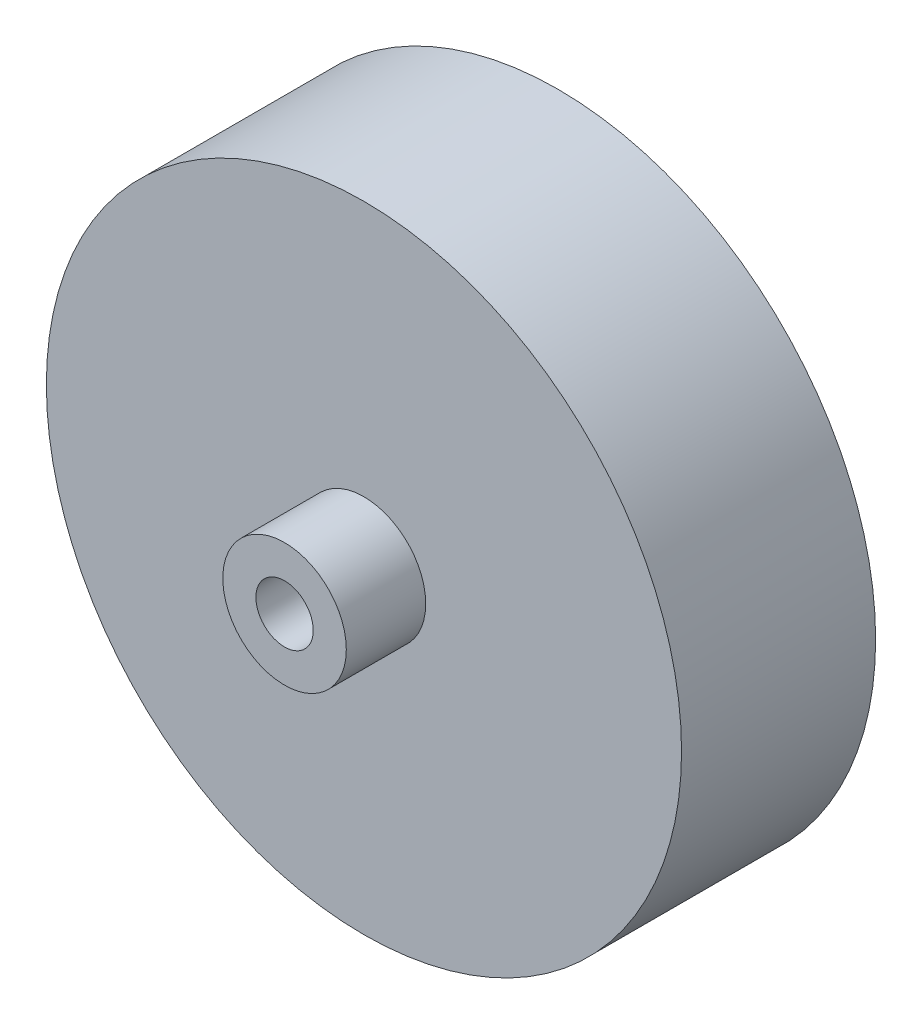
ISO-10303-21;
HEADER;
FILE_DESCRIPTION(('STEP AP214'),'2;1');
FILE_NAME('part.step','',(''),(''),'','','');
FILE_SCHEMA(('AUTOMOTIVE_DESIGN { 1 0 10303 214 1 1 1 1 }'));
ENDSEC;
DATA;
#1=APPLICATION_CONTEXT('core data for automotive mechanical design processes');
#2=APPLICATION_PROTOCOL_DEFINITION('international standard','automotive_design',2000,#1);
#3=PRODUCT_CONTEXT('',#1,'mechanical');
#4=PRODUCT('Part','Part','',(#3));
#5=PRODUCT_RELATED_PRODUCT_CATEGORY('part','',(#4));
#6=PRODUCT_DEFINITION_FORMATION('','',#4);
#7=PRODUCT_DEFINITION_CONTEXT('part definition',#1,'design');
#8=PRODUCT_DEFINITION('design','',#6,#7);
#9=PRODUCT_DEFINITION_SHAPE('','',#8);
#10=(LENGTH_UNIT() NAMED_UNIT(*) SI_UNIT(.MILLI.,.METRE.));
#11=(NAMED_UNIT(*) PLANE_ANGLE_UNIT() SI_UNIT($,.RADIAN.));
#12=(NAMED_UNIT(*) SI_UNIT($,.STERADIAN.) SOLID_ANGLE_UNIT());
#13=UNCERTAINTY_MEASURE_WITH_UNIT(LENGTH_MEASURE(1.E-05),#10,'distance_accuracy_value','');
#14=(GEOMETRIC_REPRESENTATION_CONTEXT(3) GLOBAL_UNCERTAINTY_ASSIGNED_CONTEXT((#13)) GLOBAL_UNIT_ASSIGNED_CONTEXT((#10,
#11,#12)) REPRESENTATION_CONTEXT('',''));
#15=CARTESIAN_POINT('',(0.,0.,0.));
#16=DIRECTION('',(0.,0.,1.));
#17=DIRECTION('',(1.,0.,0.));
#18=AXIS2_PLACEMENT_3D('',#15,#16,#17);
#19=CARTESIAN_POINT('',(0.,0.,22.));
#20=DIRECTION('',(0.,0.,-1.));
#21=DIRECTION('',(-1.,0.,0.));
#22=AXIS2_PLACEMENT_3D('',#19,#20,#21);
#23=CYLINDRICAL_SURFACE('',#22,36.);
#24=CARTESIAN_POINT('',(0.,0.,22.));
#25=DIRECTION('',(0.,0.,1.));
#26=DIRECTION('',(1.,0.,0.));
#27=AXIS2_PLACEMENT_3D('',#24,#25,#26);
#28=CIRCLE('',#27,36.);
#29=CARTESIAN_POINT('',(36.,0.,22.));
#30=VERTEX_POINT('',#29);
#31=EDGE_CURVE('E51',#30,#30,#28,.T.);
#32=ORIENTED_EDGE('',*,*,#31,.F.);
#33=EDGE_LOOP('',(#32));
#34=FACE_BOUND('',#33,.T.);
#35=CARTESIAN_POINT('',(0.,0.,0.));
#36=DIRECTION('',(0.,0.,1.));
#37=DIRECTION('',(1.,0.,0.));
#38=AXIS2_PLACEMENT_3D('',#35,#36,#37);
#39=CIRCLE('',#38,36.);
#40=CARTESIAN_POINT('',(36.,0.,0.));
#41=VERTEX_POINT('',#40);
#42=EDGE_CURVE('E47',#41,#41,#39,.T.);
#43=ORIENTED_EDGE('',*,*,#42,.T.);
#44=EDGE_LOOP('',(#43));
#45=FACE_BOUND('',#44,.T.);
#46=ADVANCED_FACE('F44',(#34,#45),#23,.T.);
#47=CARTESIAN_POINT('',(0.,0.,22.));
#48=DIRECTION('',(0.,0.,1.));
#49=DIRECTION('',(1.,0.,0.));
#50=AXIS2_PLACEMENT_3D('',#47,#48,#49);
#51=PLANE('',#50);
#52=CARTESIAN_POINT('',(0.,0.,22.));
#53=DIRECTION('',(0.,0.,1.));
#54=DIRECTION('',(1.,0.,0.));
#55=AXIS2_PLACEMENT_3D('',#52,#53,#54);
#56=CIRCLE('',#55,7.);
#57=CARTESIAN_POINT('',(7.,0.,22.));
#58=VERTEX_POINT('',#57);
#59=EDGE_CURVE('E12',#58,#58,#56,.T.);
#60=ORIENTED_EDGE('',*,*,#59,.F.);
#61=EDGE_LOOP('',(#60));
#62=FACE_BOUND('',#61,.T.);
#63=ORIENTED_EDGE('',*,*,#31,.T.);
#64=EDGE_LOOP('',(#63));
#65=FACE_BOUND('',#64,.T.);
#66=ADVANCED_FACE('F88',(#62,#65),#51,.T.);
#67=CARTESIAN_POINT('',(0.,0.,0.));
#68=DIRECTION('',(0.,0.,1.));
#69=DIRECTION('',(1.,0.,0.));
#70=AXIS2_PLACEMENT_3D('',#67,#68,#69);
#71=PLANE('',#70);
#72=CARTESIAN_POINT('',(0.,0.,0.));
#73=DIRECTION('',(0.,0.,1.));
#74=DIRECTION('',(1.,0.,0.));
#75=AXIS2_PLACEMENT_3D('',#72,#73,#74);
#76=CIRCLE('',#75,3.25);
#77=CARTESIAN_POINT('',(3.25,0.,0.));
#78=VERTEX_POINT('',#77);
#79=EDGE_CURVE('E60',#78,#78,#76,.T.);
#80=ORIENTED_EDGE('',*,*,#79,.T.);
#81=EDGE_LOOP('',(#80));
#82=FACE_BOUND('',#81,.T.);
#83=ORIENTED_EDGE('',*,*,#42,.F.);
#84=EDGE_LOOP('',(#83));
#85=FACE_BOUND('',#84,.T.);
#86=ADVANCED_FACE('F67',(#82,#85),#71,.F.);
#87=CARTESIAN_POINT('',(0.,0.,31.));
#88=DIRECTION('',(0.,0.,-1.));
#89=DIRECTION('',(-1.,0.,0.));
#90=AXIS2_PLACEMENT_3D('',#87,#88,#89);
#91=CYLINDRICAL_SURFACE('',#90,7.);
#92=CARTESIAN_POINT('',(0.,0.,31.));
#93=DIRECTION('',(0.,0.,1.));
#94=DIRECTION('',(1.,0.,0.));
#95=AXIS2_PLACEMENT_3D('',#92,#93,#94);
#96=CIRCLE('',#95,7.);
#97=CARTESIAN_POINT('',(7.,0.,31.));
#98=VERTEX_POINT('',#97);
#99=EDGE_CURVE('E57',#98,#98,#96,.T.);
#100=ORIENTED_EDGE('',*,*,#99,.F.);
#101=EDGE_LOOP('',(#100));
#102=FACE_BOUND('',#101,.T.);
#103=ORIENTED_EDGE('',*,*,#59,.T.);
#104=EDGE_LOOP('',(#103));
#105=FACE_BOUND('',#104,.T.);
#106=ADVANCED_FACE('F79',(#102,#105),#91,.T.);
#107=CARTESIAN_POINT('',(0.,0.,31.));
#108=DIRECTION('',(0.,0.,1.));
#109=DIRECTION('',(1.,0.,0.));
#110=AXIS2_PLACEMENT_3D('',#107,#108,#109);
#111=PLANE('',#110);
#112=CARTESIAN_POINT('',(0.,0.,31.));
#113=DIRECTION('',(0.,0.,1.));
#114=DIRECTION('',(1.,0.,0.));
#115=AXIS2_PLACEMENT_3D('',#112,#113,#114);
#116=CIRCLE('',#115,3.25);
#117=CARTESIAN_POINT('',(3.25,0.,31.));
#118=VERTEX_POINT('',#117);
#119=EDGE_CURVE('E61',#118,#118,#116,.T.);
#120=ORIENTED_EDGE('',*,*,#119,.F.);
#121=EDGE_LOOP('',(#120));
#122=FACE_BOUND('',#121,.T.);
#123=ORIENTED_EDGE('',*,*,#99,.T.);
#124=EDGE_LOOP('',(#123));
#125=FACE_BOUND('',#124,.T.);
#126=ADVANCED_FACE('F73',(#122,#125),#111,.T.);
#127=CARTESIAN_POINT('',(0.,0.,0.));
#128=DIRECTION('',(0.,0.,1.));
#129=DIRECTION('',(1.,0.,0.));
#130=AXIS2_PLACEMENT_3D('',#127,#128,#129);
#131=CYLINDRICAL_SURFACE('',#130,3.25);
#132=ORIENTED_EDGE('',*,*,#79,.F.);
#133=EDGE_LOOP('',(#132));
#134=FACE_BOUND('',#133,.T.);
#135=ORIENTED_EDGE('',*,*,#119,.T.);
#136=EDGE_LOOP('',(#135));
#137=FACE_BOUND('',#136,.T.);
#138=ADVANCED_FACE('F70',(#134,#137),#131,.F.);
#139=CLOSED_SHELL('',(#46,#66,#86,#106,#126,#138));
#140=MANIFOLD_SOLID_BREP('B2',#139);
#141=ADVANCED_BREP_SHAPE_REPRESENTATION('',(#18,#140),#14);
#142=SHAPE_DEFINITION_REPRESENTATION(#9,#141);
ENDSEC;
END-ISO-10303-21;
